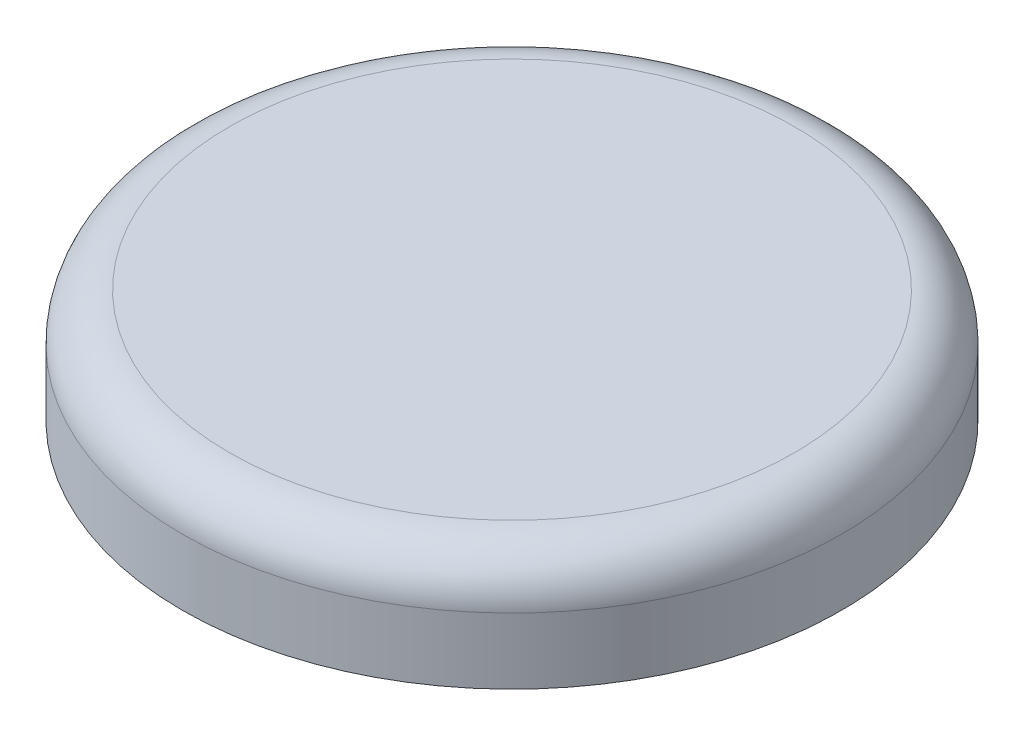
ISO-10303-21;
HEADER;
FILE_DESCRIPTION(('STEP AP214'),'2;1');
FILE_NAME('part.step','',(''),(''),'','','');
FILE_SCHEMA(('AUTOMOTIVE_DESIGN { 1 0 10303 214 1 1 1 1 }'));
ENDSEC;
DATA;
#1=APPLICATION_CONTEXT('core data for automotive mechanical design processes');
#2=APPLICATION_PROTOCOL_DEFINITION('international standard','automotive_design',2000,#1);
#3=PRODUCT_CONTEXT('',#1,'mechanical');
#4=PRODUCT('Part','Part','',(#3));
#5=PRODUCT_RELATED_PRODUCT_CATEGORY('part','',(#4));
#6=PRODUCT_DEFINITION_FORMATION('','',#4);
#7=PRODUCT_DEFINITION_CONTEXT('part definition',#1,'design');
#8=PRODUCT_DEFINITION('design','',#6,#7);
#9=PRODUCT_DEFINITION_SHAPE('','',#8);
#10=(LENGTH_UNIT() NAMED_UNIT(*) SI_UNIT(.MILLI.,.METRE.));
#11=(NAMED_UNIT(*) PLANE_ANGLE_UNIT() SI_UNIT($,.RADIAN.));
#12=(NAMED_UNIT(*) SI_UNIT($,.STERADIAN.) SOLID_ANGLE_UNIT());
#13=UNCERTAINTY_MEASURE_WITH_UNIT(LENGTH_MEASURE(1.E-05),#10,'distance_accuracy_value','');
#14=(GEOMETRIC_REPRESENTATION_CONTEXT(3) GLOBAL_UNCERTAINTY_ASSIGNED_CONTEXT((#13)) GLOBAL_UNIT_ASSIGNED_CONTEXT((#10,
#11,#12)) REPRESENTATION_CONTEXT('',''));
#15=CARTESIAN_POINT('',(0.,0.,0.));
#16=DIRECTION('',(0.,0.,1.));
#17=DIRECTION('',(1.,0.,0.));
#18=AXIS2_PLACEMENT_3D('',#15,#16,#17);
#19=CARTESIAN_POINT('',(0.,12.,0.));
#20=DIRECTION('',(0.,-1.,0.));
#21=DIRECTION('',(0.,0.,-1.));
#22=AXIS2_PLACEMENT_3D('',#19,#20,#21);
#23=CYLINDRICAL_SURFACE('',#22,35.);
#24=CARTESIAN_POINT('',(0.,7.,0.));
#25=DIRECTION('',(0.,1.,0.));
#26=DIRECTION('',(0.,0.,1.));
#27=AXIS2_PLACEMENT_3D('',#24,#25,#26);
#28=CIRCLE('',#27,35.);
#29=CARTESIAN_POINT('',(0.,7.,35.));
#30=VERTEX_POINT('',#29);
#31=EDGE_CURVE('E379',#30,#30,#28,.F.);
#32=ORIENTED_EDGE('',*,*,#31,.T.);
#33=EDGE_LOOP('',(#32));
#34=FACE_BOUND('',#33,.T.);
#35=CARTESIAN_POINT('',(0.,0.,0.));
#36=DIRECTION('',(0.,1.,0.));
#37=DIRECTION('',(0.,0.,1.));
#38=AXIS2_PLACEMENT_3D('',#35,#36,#37);
#39=CIRCLE('',#38,35.);
#40=CARTESIAN_POINT('',(0.,0.,35.));
#41=VERTEX_POINT('',#40);
#42=EDGE_CURVE('E230',#41,#41,#39,.T.);
#43=ORIENTED_EDGE('',*,*,#42,.T.);
#44=EDGE_LOOP('',(#43));
#45=FACE_BOUND('',#44,.T.);
#46=ADVANCED_FACE('F38',(#34,#45),#23,.T.);
#47=CARTESIAN_POINT('',(0.,12.,0.));
#48=DIRECTION('',(0.,1.,0.));
#49=DIRECTION('',(0.,0.,1.));
#50=AXIS2_PLACEMENT_3D('',#47,#48,#49);
#51=PLANE('',#50);
#52=CARTESIAN_POINT('',(0.,12.,0.));
#53=DIRECTION('',(0.,1.,0.));
#54=DIRECTION('',(0.,0.,1.));
#55=AXIS2_PLACEMENT_3D('',#52,#53,#54);
#56=CIRCLE('',#55,30.);
#57=CARTESIAN_POINT('',(0.,12.,30.));
#58=VERTEX_POINT('',#57);
#59=EDGE_CURVE('E375',#58,#58,#56,.T.);
#60=ORIENTED_EDGE('',*,*,#59,.T.);
#61=EDGE_LOOP('',(#60));
#62=FACE_BOUND('',#61,.T.);
#63=ADVANCED_FACE('F403',(#62),#51,.T.);
#64=CARTESIAN_POINT('',(0.,0.,0.));
#65=DIRECTION('',(0.,1.,0.));
#66=DIRECTION('',(0.,0.,1.));
#67=AXIS2_PLACEMENT_3D('',#64,#65,#66);
#68=PLANE('',#67);
#69=CARTESIAN_POINT('',(0.,0.,0.));
#70=DIRECTION('',(0.,-1.,0.));
#71=DIRECTION('',(0.,0.,-1.));
#72=AXIS2_PLACEMENT_3D('',#69,#70,#71);
#73=CIRCLE('',#72,23.6);
#74=CARTESIAN_POINT('',(0.,0.,-23.6));
#75=VERTEX_POINT('',#74);
#76=EDGE_CURVE('E546',#75,#75,#73,.T.);
#77=ORIENTED_EDGE('',*,*,#76,.F.);
#78=EDGE_LOOP('',(#77));
#79=FACE_BOUND('',#78,.T.);
#80=DIRECTION('',(0.,0.,1.));
#81=VECTOR('',#80,1.);
#82=CARTESIAN_POINT('',(32.7,0.,-2.13619599600162));
#83=LINE('',#82,#81);
#84=CARTESIAN_POINT('',(32.7,0.,-2.13619599600162));
#85=VERTEX_POINT('',#84);
#86=CARTESIAN_POINT('',(32.7,0.,2.13619599600162));
#87=VERTEX_POINT('',#86);
#88=EDGE_CURVE('E212',#85,#87,#83,.T.);
#89=ORIENTED_EDGE('',*,*,#88,.F.);
#90=DIRECTION('',(0.866025403784438,0.,0.5));
#91=VECTOR('',#90,1.);
#92=CARTESIAN_POINT('',(29.,0.,-4.27239199200323));
#93=LINE('',#92,#91);
#94=CARTESIAN_POINT('',(29.,0.,-4.27239199200323));
#95=VERTEX_POINT('',#94);
#96=EDGE_CURVE('E55',#95,#85,#93,.T.);
#97=ORIENTED_EDGE('',*,*,#96,.F.);
#98=DIRECTION('',(0.866025403784438,0.,-0.5));
#99=VECTOR('',#98,1.);
#100=CARTESIAN_POINT('',(25.3,0.,-2.13619599600162));
#101=LINE('',#100,#99);
#102=CARTESIAN_POINT('',(25.3,0.,-2.13619599600162));
#103=VERTEX_POINT('',#102);
#104=EDGE_CURVE('E189',#103,#95,#101,.T.);
#105=ORIENTED_EDGE('',*,*,#104,.F.);
#106=DIRECTION('',(0.,0.,-1.));
#107=VECTOR('',#106,1.);
#108=CARTESIAN_POINT('',(25.3,0.,2.13619599600162));
#109=LINE('',#108,#107);
#110=CARTESIAN_POINT('',(25.3,0.,2.13619599600162));
#111=VERTEX_POINT('',#110);
#112=EDGE_CURVE('E193',#111,#103,#109,.T.);
#113=ORIENTED_EDGE('',*,*,#112,.F.);
#114=DIRECTION('',(-0.866025403784439,0.,-0.5));
#115=VECTOR('',#114,1.);
#116=CARTESIAN_POINT('',(29.,0.,4.27239199200323));
#117=LINE('',#116,#115);
#118=CARTESIAN_POINT('',(29.,0.,4.27239199200323));
#119=VERTEX_POINT('',#118);
#120=EDGE_CURVE('E220',#119,#111,#117,.T.);
#121=ORIENTED_EDGE('',*,*,#120,.F.);
#122=DIRECTION('',(-0.866025403784439,0.,0.5));
#123=VECTOR('',#122,1.);
#124=CARTESIAN_POINT('',(32.7,0.,2.13619599600162));
#125=LINE('',#124,#123);
#126=EDGE_CURVE('E216',#87,#119,#125,.T.);
#127=ORIENTED_EDGE('',*,*,#126,.F.);
#128=EDGE_LOOP('',(#89,#97,#105,#113,#121,#127));
#129=FACE_BOUND('',#128,.T.);
#130=DIRECTION('',(0.866025403784439,0.,-0.499999999999999));
#131=VECTOR('',#130,1.);
#132=CARTESIAN_POINT('',(-18.199999999999,0.,-27.2509327057519));
#133=LINE('',#132,#131);
#134=CARTESIAN_POINT('',(-18.199999999999,0.,-27.2509327057519));
#135=VERTEX_POINT('',#134);
#136=CARTESIAN_POINT('',(-14.499999999999,0.,-29.3871287017535));
#137=VERTEX_POINT('',#136);
#138=EDGE_CURVE('E270',#135,#137,#133,.T.);
#139=ORIENTED_EDGE('',*,*,#138,.F.);
#140=DIRECTION('',(0.,0.,-1.));
#141=VECTOR('',#140,1.);
#142=CARTESIAN_POINT('',(-18.199999999999,0.,-22.9785407137486));
#143=LINE('',#142,#141);
#144=CARTESIAN_POINT('',(-18.199999999999,0.,-22.9785407137486));
#145=VERTEX_POINT('',#144);
#146=EDGE_CURVE('E63',#145,#135,#143,.T.);
#147=ORIENTED_EDGE('',*,*,#146,.F.);
#148=DIRECTION('',(-0.866025403784438,0.,-0.500000000000001));
#149=VECTOR('',#148,1.);
#150=CARTESIAN_POINT('',(-14.499999999999,0.,-20.842344717747));
#151=LINE('',#150,#149);
#152=CARTESIAN_POINT('',(-14.499999999999,0.,-20.842344717747));
#153=VERTEX_POINT('',#152);
#154=EDGE_CURVE('E247',#153,#145,#151,.T.);
#155=ORIENTED_EDGE('',*,*,#154,.F.);
#156=DIRECTION('',(-0.866025403784439,0.,0.5));
#157=VECTOR('',#156,1.);
#158=CARTESIAN_POINT('',(-10.799999999999,0.,-22.9785407137486));
#159=LINE('',#158,#157);
#160=CARTESIAN_POINT('',(-10.799999999999,0.,-22.9785407137486));
#161=VERTEX_POINT('',#160);
#162=EDGE_CURVE('E283',#161,#153,#159,.T.);
#163=ORIENTED_EDGE('',*,*,#162,.F.);
#164=DIRECTION('',(0.,0.,1.));
#165=VECTOR('',#164,1.);
#166=CARTESIAN_POINT('',(-10.799999999999,0.,-27.2509327057519));
#167=LINE('',#166,#165);
#168=CARTESIAN_POINT('',(-10.799999999999,0.,-27.2509327057519));
#169=VERTEX_POINT('',#168);
#170=EDGE_CURVE('E279',#169,#161,#167,.T.);
#171=ORIENTED_EDGE('',*,*,#170,.F.);
#172=DIRECTION('',(0.866025403784438,0.,0.500000000000001));
#173=VECTOR('',#172,1.);
#174=CARTESIAN_POINT('',(-14.499999999999,0.,-29.3871287017535));
#175=LINE('',#174,#173);
#176=EDGE_CURVE('E275',#137,#169,#175,.T.);
#177=ORIENTED_EDGE('',*,*,#176,.F.);
#178=EDGE_LOOP('',(#139,#147,#155,#163,#171,#177));
#179=FACE_BOUND('',#178,.T.);
#180=DIRECTION('',(-0.866025403784438,0.,-0.500000000000001));
#181=VECTOR('',#180,1.);
#182=CARTESIAN_POINT('',(-14.5000000000008,0.,29.3871287017503));
#183=LINE('',#182,#181);
#184=CARTESIAN_POINT('',(-14.5000000000008,0.,29.3871287017503));
#185=VERTEX_POINT('',#184);
#186=CARTESIAN_POINT('',(-18.2000000000008,0.,27.2509327057487));
#187=VERTEX_POINT('',#186);
#188=EDGE_CURVE('E335',#185,#187,#183,.T.);
#189=ORIENTED_EDGE('',*,*,#188,.F.);
#190=DIRECTION('',(-0.866025403784439,0.,0.5));
#191=VECTOR('',#190,1.);
#192=CARTESIAN_POINT('',(-10.8000000000008,0.,27.2509327057487));
#193=LINE('',#192,#191);
#194=CARTESIAN_POINT('',(-10.8000000000008,0.,27.2509327057487));
#195=VERTEX_POINT('',#194);
#196=EDGE_CURVE('E332',#195,#185,#193,.T.);
#197=ORIENTED_EDGE('',*,*,#196,.F.);
#198=DIRECTION('',(0.,0.,1.));
#199=VECTOR('',#198,1.);
#200=CARTESIAN_POINT('',(-10.8000000000008,0.,22.9785407137455));
#201=LINE('',#200,#199);
#202=CARTESIAN_POINT('',(-10.8000000000008,0.,22.9785407137455));
#203=VERTEX_POINT('',#202);
#204=EDGE_CURVE('E311',#203,#195,#201,.T.);
#205=ORIENTED_EDGE('',*,*,#204,.F.);
#206=DIRECTION('',(0.866025403784438,0.,0.500000000000001));
#207=VECTOR('',#206,1.);
#208=CARTESIAN_POINT('',(-14.5000000000008,0.,20.8423447177438));
#209=LINE('',#208,#207);
#210=CARTESIAN_POINT('',(-14.5000000000008,0.,20.8423447177438));
#211=VERTEX_POINT('',#210);
#212=EDGE_CURVE('E348',#211,#203,#209,.T.);
#213=ORIENTED_EDGE('',*,*,#212,.F.);
#214=DIRECTION('',(0.866025403784439,0.,-0.499999999999999));
#215=VECTOR('',#214,1.);
#216=CARTESIAN_POINT('',(-18.2000000000008,0.,22.9785407137455));
#217=LINE('',#216,#215);
#218=CARTESIAN_POINT('',(-18.2000000000008,0.,22.9785407137455));
#219=VERTEX_POINT('',#218);
#220=EDGE_CURVE('E344',#219,#211,#217,.T.);
#221=ORIENTED_EDGE('',*,*,#220,.F.);
#222=DIRECTION('',(0.,0.,-1.));
#223=VECTOR('',#222,1.);
#224=CARTESIAN_POINT('',(-18.2000000000008,0.,27.2509327057487));
#225=LINE('',#224,#223);
#226=EDGE_CURVE('E340',#187,#219,#225,.T.);
#227=ORIENTED_EDGE('',*,*,#226,.F.);
#228=EDGE_LOOP('',(#189,#197,#205,#213,#221,#227));
#229=FACE_BOUND('',#228,.T.);
#230=ORIENTED_EDGE('',*,*,#42,.F.);
#231=EDGE_LOOP('',(#230));
#232=FACE_BOUND('',#231,.T.);
#233=ADVANCED_FACE('F409',(#79,#129,#179,#229,#232),#68,.F.);
#234=CARTESIAN_POINT('',(-10.8000000000008,4.,27.2509327057487));
#235=DIRECTION('',(0.5,0.,0.866025403784439));
#236=DIRECTION('',(0.866025403784439,0.,-0.5));
#237=AXIS2_PLACEMENT_3D('',#234,#235,#236);
#238=PLANE('',#237);
#239=ORIENTED_EDGE('',*,*,#196,.T.);
#240=DIRECTION('',(0.,-1.,0.));
#241=VECTOR('',#240,1.);
#242=CARTESIAN_POINT('',(-14.5000000000008,4.,29.3871287017503));
#243=LINE('',#242,#241);
#244=CARTESIAN_POINT('',(-14.5000000000008,4.,29.3871287017503));
#245=VERTEX_POINT('',#244);
#246=EDGE_CURVE('E331',#245,#185,#243,.T.);
#247=ORIENTED_EDGE('',*,*,#246,.F.);
#248=DIRECTION('',(-0.866025403784439,0.,0.5));
#249=VECTOR('',#248,1.);
#250=CARTESIAN_POINT('',(-10.8000000000008,4.,27.2509327057487));
#251=LINE('',#250,#249);
#252=CARTESIAN_POINT('',(-10.8000000000008,4.,27.2509327057487));
#253=VERTEX_POINT('',#252);
#254=EDGE_CURVE('E306',#253,#245,#251,.T.);
#255=ORIENTED_EDGE('',*,*,#254,.F.);
#256=DIRECTION('',(0.,-1.,0.));
#257=VECTOR('',#256,1.);
#258=CARTESIAN_POINT('',(-10.8000000000008,4.,27.2509327057487));
#259=LINE('',#258,#257);
#260=EDGE_CURVE('E271',#253,#195,#259,.T.);
#261=ORIENTED_EDGE('',*,*,#260,.T.);
#262=EDGE_LOOP('',(#239,#247,#255,#261));
#263=FACE_BOUND('',#262,.T.);
#264=ADVANCED_FACE('F502',(#263),#238,.F.);
#265=CARTESIAN_POINT('',(-10.8000000000008,4.,22.9785407137455));
#266=DIRECTION('',(1.,0.,0.));
#267=DIRECTION('',(0.,0.,-1.));
#268=AXIS2_PLACEMENT_3D('',#265,#266,#267);
#269=PLANE('',#268);
#270=ORIENTED_EDGE('',*,*,#204,.T.);
#271=ORIENTED_EDGE('',*,*,#260,.F.);
#272=DIRECTION('',(0.,0.,1.));
#273=VECTOR('',#272,1.);
#274=CARTESIAN_POINT('',(-10.8000000000008,4.,22.9785407137455));
#275=LINE('',#274,#273);
#276=CARTESIAN_POINT('',(-10.8000000000008,4.,22.9785407137455));
#277=VERTEX_POINT('',#276);
#278=EDGE_CURVE('E327',#277,#253,#275,.T.);
#279=ORIENTED_EDGE('',*,*,#278,.F.);
#280=DIRECTION('',(0.,-1.,0.));
#281=VECTOR('',#280,1.);
#282=CARTESIAN_POINT('',(-10.8000000000008,4.,22.9785407137455));
#283=LINE('',#282,#281);
#284=EDGE_CURVE('E357',#277,#203,#283,.T.);
#285=ORIENTED_EDGE('',*,*,#284,.T.);
#286=EDGE_LOOP('',(#270,#271,#279,#285));
#287=FACE_BOUND('',#286,.T.);
#288=ADVANCED_FACE('F498',(#287),#269,.F.);
#289=CARTESIAN_POINT('',(-14.5000000000008,4.,20.8423447177438));
#290=DIRECTION('',(0.500000000000001,0.,-0.866025403784438));
#291=DIRECTION('',(-0.866025403784438,0.,-0.500000000000001));
#292=AXIS2_PLACEMENT_3D('',#289,#290,#291);
#293=PLANE('',#292);
#294=ORIENTED_EDGE('',*,*,#212,.T.);
#295=ORIENTED_EDGE('',*,*,#284,.F.);
#296=DIRECTION('',(0.866025403784438,0.,0.500000000000001));
#297=VECTOR('',#296,1.);
#298=CARTESIAN_POINT('',(-14.5000000000008,4.,20.8423447177438));
#299=LINE('',#298,#297);
#300=CARTESIAN_POINT('',(-14.5000000000008,4.,20.8423447177438));
#301=VERTEX_POINT('',#300);
#302=EDGE_CURVE('E323',#301,#277,#299,.T.);
#303=ORIENTED_EDGE('',*,*,#302,.F.);
#304=DIRECTION('',(0.,-1.,0.));
#305=VECTOR('',#304,1.);
#306=CARTESIAN_POINT('',(-14.5000000000008,4.,20.8423447177438));
#307=LINE('',#306,#305);
#308=EDGE_CURVE('E360',#301,#211,#307,.T.);
#309=ORIENTED_EDGE('',*,*,#308,.T.);
#310=EDGE_LOOP('',(#294,#295,#303,#309));
#311=FACE_BOUND('',#310,.T.);
#312=ADVANCED_FACE('F501',(#311),#293,.F.);
#313=CARTESIAN_POINT('',(-18.2000000000008,4.,22.9785407137455));
#314=DIRECTION('',(-0.499999999999999,0.,-0.866025403784439));
#315=DIRECTION('',(-0.866025403784439,0.,0.499999999999999));
#316=AXIS2_PLACEMENT_3D('',#313,#314,#315);
#317=PLANE('',#316);
#318=ORIENTED_EDGE('',*,*,#220,.T.);
#319=ORIENTED_EDGE('',*,*,#308,.F.);
#320=DIRECTION('',(0.866025403784439,0.,-0.499999999999999));
#321=VECTOR('',#320,1.);
#322=CARTESIAN_POINT('',(-18.2000000000008,4.,22.9785407137455));
#323=LINE('',#322,#321);
#324=CARTESIAN_POINT('',(-18.2000000000008,4.,22.9785407137455));
#325=VERTEX_POINT('',#324);
#326=EDGE_CURVE('E319',#325,#301,#323,.T.);
#327=ORIENTED_EDGE('',*,*,#326,.F.);
#328=DIRECTION('',(0.,-1.,0.));
#329=VECTOR('',#328,1.);
#330=CARTESIAN_POINT('',(-18.2000000000008,4.,22.9785407137455));
#331=LINE('',#330,#329);
#332=EDGE_CURVE('E363',#325,#219,#331,.T.);
#333=ORIENTED_EDGE('',*,*,#332,.T.);
#334=EDGE_LOOP('',(#318,#319,#327,#333));
#335=FACE_BOUND('',#334,.T.);
#336=ADVANCED_FACE('F506',(#335),#317,.F.);
#337=CARTESIAN_POINT('',(-18.2000000000008,4.,27.2509327057487));
#338=DIRECTION('',(-1.,0.,0.));
#339=DIRECTION('',(0.,0.,1.));
#340=AXIS2_PLACEMENT_3D('',#337,#338,#339);
#341=PLANE('',#340);
#342=ORIENTED_EDGE('',*,*,#226,.T.);
#343=ORIENTED_EDGE('',*,*,#332,.F.);
#344=DIRECTION('',(0.,0.,-1.));
#345=VECTOR('',#344,1.);
#346=CARTESIAN_POINT('',(-18.2000000000008,4.,27.2509327057487));
#347=LINE('',#346,#345);
#348=CARTESIAN_POINT('',(-18.2000000000008,4.,27.2509327057487));
#349=VERTEX_POINT('',#348);
#350=EDGE_CURVE('E315',#349,#325,#347,.T.);
#351=ORIENTED_EDGE('',*,*,#350,.F.);
#352=DIRECTION('',(0.,-1.,0.));
#353=VECTOR('',#352,1.);
#354=CARTESIAN_POINT('',(-18.2000000000008,4.,27.2509327057487));
#355=LINE('',#354,#353);
#356=EDGE_CURVE('E366',#349,#187,#355,.T.);
#357=ORIENTED_EDGE('',*,*,#356,.T.);
#358=EDGE_LOOP('',(#342,#343,#351,#357));
#359=FACE_BOUND('',#358,.T.);
#360=ADVANCED_FACE('F510',(#359),#341,.F.);
#361=CARTESIAN_POINT('',(-14.5000000000008,4.,29.3871287017503));
#362=DIRECTION('',(-0.500000000000001,0.,0.866025403784438));
#363=DIRECTION('',(0.866025403784438,0.,0.500000000000001));
#364=AXIS2_PLACEMENT_3D('',#361,#362,#363);
#365=PLANE('',#364);
#366=ORIENTED_EDGE('',*,*,#188,.T.);
#367=ORIENTED_EDGE('',*,*,#356,.F.);
#368=DIRECTION('',(-0.866025403784438,0.,-0.500000000000001));
#369=VECTOR('',#368,1.);
#370=CARTESIAN_POINT('',(-14.5000000000008,4.,29.3871287017503));
#371=LINE('',#370,#369);
#372=EDGE_CURVE('E310',#245,#349,#371,.T.);
#373=ORIENTED_EDGE('',*,*,#372,.F.);
#374=ORIENTED_EDGE('',*,*,#246,.T.);
#375=EDGE_LOOP('',(#366,#367,#373,#374));
#376=FACE_BOUND('',#375,.T.);
#377=ADVANCED_FACE('F496',(#376),#365,.F.);
#378=CARTESIAN_POINT('',(0.,4.,0.));
#379=DIRECTION('',(0.,-1.,0.));
#380=DIRECTION('',(0.,0.,-1.));
#381=AXIS2_PLACEMENT_3D('',#378,#379,#380);
#382=PLANE('',#381);
#383=CARTESIAN_POINT('',(-14.4999999999998,4.,25.1147367097489));
#384=DIRECTION('',(0.,-1.,0.));
#385=DIRECTION('',(0.,0.,-1.));
#386=AXIS2_PLACEMENT_3D('',#383,#384,#385);
#387=CIRCLE('',#386,2.00000000000001);
#388=CARTESIAN_POINT('',(-14.4999999999998,4.,23.1147367097488));
#389=VERTEX_POINT('',#388);
#390=EDGE_CURVE('E196',#389,#389,#387,.T.);
#391=ORIENTED_EDGE('',*,*,#390,.F.);
#392=EDGE_LOOP('',(#391));
#393=FACE_BOUND('',#392,.T.);
#394=ORIENTED_EDGE('',*,*,#254,.T.);
#395=ORIENTED_EDGE('',*,*,#372,.T.);
#396=ORIENTED_EDGE('',*,*,#350,.T.);
#397=ORIENTED_EDGE('',*,*,#326,.T.);
#398=ORIENTED_EDGE('',*,*,#302,.T.);
#399=ORIENTED_EDGE('',*,*,#278,.T.);
#400=EDGE_LOOP('',(#394,#395,#396,#397,#398,#399));
#401=FACE_BOUND('',#400,.T.);
#402=ADVANCED_FACE('F493',(#393,#401),#382,.T.);
#403=CARTESIAN_POINT('',(-18.199999999999,4.,-22.9785407137486));
#404=DIRECTION('',(-1.,0.,0.));
#405=DIRECTION('',(0.,0.,1.));
#406=AXIS2_PLACEMENT_3D('',#403,#404,#405);
#407=PLANE('',#406);
#408=ORIENTED_EDGE('',*,*,#146,.T.);
#409=DIRECTION('',(0.,-1.,0.));
#410=VECTOR('',#409,1.);
#411=CARTESIAN_POINT('',(-18.199999999999,4.,-27.2509327057519));
#412=LINE('',#411,#410);
#413=CARTESIAN_POINT('',(-18.199999999999,4.,-27.2509327057519));
#414=VERTEX_POINT('',#413);
#415=EDGE_CURVE('E267',#414,#135,#412,.T.);
#416=ORIENTED_EDGE('',*,*,#415,.F.);
#417=DIRECTION('',(0.,0.,-1.));
#418=VECTOR('',#417,1.);
#419=CARTESIAN_POINT('',(-18.199999999999,4.,-22.9785407137486));
#420=LINE('',#419,#418);
#421=CARTESIAN_POINT('',(-18.199999999999,4.,-22.9785407137486));
#422=VERTEX_POINT('',#421);
#423=EDGE_CURVE('E242',#422,#414,#420,.T.);
#424=ORIENTED_EDGE('',*,*,#423,.F.);
#425=DIRECTION('',(0.,-1.,0.));
#426=VECTOR('',#425,1.);
#427=CARTESIAN_POINT('',(-18.199999999999,4.,-22.9785407137486));
#428=LINE('',#427,#426);
#429=EDGE_CURVE('E213',#422,#145,#428,.T.);
#430=ORIENTED_EDGE('',*,*,#429,.T.);
#431=EDGE_LOOP('',(#408,#416,#424,#430));
#432=FACE_BOUND('',#431,.T.);
#433=ADVANCED_FACE('F475',(#432),#407,.F.);
#434=CARTESIAN_POINT('',(-14.499999999999,4.,-20.842344717747));
#435=DIRECTION('',(-0.500000000000001,0.,0.866025403784438));
#436=DIRECTION('',(0.866025403784438,0.,0.500000000000001));
#437=AXIS2_PLACEMENT_3D('',#434,#435,#436);
#438=PLANE('',#437);
#439=ORIENTED_EDGE('',*,*,#154,.T.);
#440=ORIENTED_EDGE('',*,*,#429,.F.);
#441=DIRECTION('',(-0.866025403784438,0.,-0.500000000000001));
#442=VECTOR('',#441,1.);
#443=CARTESIAN_POINT('',(-14.499999999999,4.,-20.842344717747));
#444=LINE('',#443,#442);
#445=CARTESIAN_POINT('',(-14.499999999999,4.,-20.842344717747));
#446=VERTEX_POINT('',#445);
#447=EDGE_CURVE('E263',#446,#422,#444,.T.);
#448=ORIENTED_EDGE('',*,*,#447,.F.);
#449=DIRECTION('',(0.,-1.,0.));
#450=VECTOR('',#449,1.);
#451=CARTESIAN_POINT('',(-14.499999999999,4.,-20.842344717747));
#452=LINE('',#451,#450);
#453=EDGE_CURVE('E292',#446,#153,#452,.T.);
#454=ORIENTED_EDGE('',*,*,#453,.T.);
#455=EDGE_LOOP('',(#439,#440,#448,#454));
#456=FACE_BOUND('',#455,.T.);
#457=ADVANCED_FACE('F471',(#456),#438,.F.);
#458=CARTESIAN_POINT('',(-10.799999999999,4.,-22.9785407137486));
#459=DIRECTION('',(0.5,0.,0.866025403784439));
#460=DIRECTION('',(0.866025403784439,0.,-0.5));
#461=AXIS2_PLACEMENT_3D('',#458,#459,#460);
#462=PLANE('',#461);
#463=ORIENTED_EDGE('',*,*,#162,.T.);
#464=ORIENTED_EDGE('',*,*,#453,.F.);
#465=DIRECTION('',(-0.866025403784439,0.,0.5));
#466=VECTOR('',#465,1.);
#467=CARTESIAN_POINT('',(-10.799999999999,4.,-22.9785407137486));
#468=LINE('',#467,#466);
#469=CARTESIAN_POINT('',(-10.799999999999,4.,-22.9785407137486));
#470=VERTEX_POINT('',#469);
#471=EDGE_CURVE('E259',#470,#446,#468,.T.);
#472=ORIENTED_EDGE('',*,*,#471,.F.);
#473=DIRECTION('',(0.,-1.,0.));
#474=VECTOR('',#473,1.);
#475=CARTESIAN_POINT('',(-10.799999999999,4.,-22.9785407137486));
#476=LINE('',#475,#474);
#477=EDGE_CURVE('E295',#470,#161,#476,.T.);
#478=ORIENTED_EDGE('',*,*,#477,.T.);
#479=EDGE_LOOP('',(#463,#464,#472,#478));
#480=FACE_BOUND('',#479,.T.);
#481=ADVANCED_FACE('F474',(#480),#462,.F.);
#482=CARTESIAN_POINT('',(-10.799999999999,4.,-27.2509327057519));
#483=DIRECTION('',(1.,0.,0.));
#484=DIRECTION('',(0.,0.,-1.));
#485=AXIS2_PLACEMENT_3D('',#482,#483,#484);
#486=PLANE('',#485);
#487=ORIENTED_EDGE('',*,*,#170,.T.);
#488=ORIENTED_EDGE('',*,*,#477,.F.);
#489=DIRECTION('',(0.,0.,1.));
#490=VECTOR('',#489,1.);
#491=CARTESIAN_POINT('',(-10.799999999999,4.,-27.2509327057519));
#492=LINE('',#491,#490);
#493=CARTESIAN_POINT('',(-10.799999999999,4.,-27.2509327057519));
#494=VERTEX_POINT('',#493);
#495=EDGE_CURVE('E255',#494,#470,#492,.T.);
#496=ORIENTED_EDGE('',*,*,#495,.F.);
#497=DIRECTION('',(0.,-1.,0.));
#498=VECTOR('',#497,1.);
#499=CARTESIAN_POINT('',(-10.799999999999,4.,-27.2509327057519));
#500=LINE('',#499,#498);
#501=EDGE_CURVE('E298',#494,#169,#500,.T.);
#502=ORIENTED_EDGE('',*,*,#501,.T.);
#503=EDGE_LOOP('',(#487,#488,#496,#502));
#504=FACE_BOUND('',#503,.T.);
#505=ADVANCED_FACE('F479',(#504),#486,.F.);
#506=CARTESIAN_POINT('',(-14.499999999999,4.,-29.3871287017535));
#507=DIRECTION('',(0.500000000000001,0.,-0.866025403784438));
#508=DIRECTION('',(-0.866025403784438,0.,-0.500000000000001));
#509=AXIS2_PLACEMENT_3D('',#506,#507,#508);
#510=PLANE('',#509);
#511=ORIENTED_EDGE('',*,*,#176,.T.);
#512=ORIENTED_EDGE('',*,*,#501,.F.);
#513=DIRECTION('',(0.866025403784438,0.,0.500000000000001));
#514=VECTOR('',#513,1.);
#515=CARTESIAN_POINT('',(-14.499999999999,4.,-29.3871287017535));
#516=LINE('',#515,#514);
#517=CARTESIAN_POINT('',(-14.499999999999,4.,-29.3871287017535));
#518=VERTEX_POINT('',#517);
#519=EDGE_CURVE('E251',#518,#494,#516,.T.);
#520=ORIENTED_EDGE('',*,*,#519,.F.);
#521=DIRECTION('',(0.,-1.,0.));
#522=VECTOR('',#521,1.);
#523=CARTESIAN_POINT('',(-14.499999999999,4.,-29.3871287017535));
#524=LINE('',#523,#522);
#525=EDGE_CURVE('E301',#518,#137,#524,.T.);
#526=ORIENTED_EDGE('',*,*,#525,.T.);
#527=EDGE_LOOP('',(#511,#512,#520,#526));
#528=FACE_BOUND('',#527,.T.);
#529=ADVANCED_FACE('F483',(#528),#510,.F.);
#530=CARTESIAN_POINT('',(-18.199999999999,4.,-27.2509327057519));
#531=DIRECTION('',(-0.499999999999999,0.,-0.866025403784439));
#532=DIRECTION('',(-0.866025403784439,0.,0.499999999999999));
#533=AXIS2_PLACEMENT_3D('',#530,#531,#532);
#534=PLANE('',#533);
#535=ORIENTED_EDGE('',*,*,#138,.T.);
#536=ORIENTED_EDGE('',*,*,#525,.F.);
#537=DIRECTION('',(0.866025403784439,0.,-0.499999999999999));
#538=VECTOR('',#537,1.);
#539=CARTESIAN_POINT('',(-18.199999999999,4.,-27.2509327057519));
#540=LINE('',#539,#538);
#541=EDGE_CURVE('E246',#414,#518,#540,.T.);
#542=ORIENTED_EDGE('',*,*,#541,.F.);
#543=ORIENTED_EDGE('',*,*,#415,.T.);
#544=EDGE_LOOP('',(#535,#536,#542,#543));
#545=FACE_BOUND('',#544,.T.);
#546=ADVANCED_FACE('F469',(#545),#534,.F.);
#547=CARTESIAN_POINT('',(0.,4.,0.));
#548=DIRECTION('',(0.,-1.,0.));
#549=DIRECTION('',(0.,0.,-1.));
#550=AXIS2_PLACEMENT_3D('',#547,#548,#549);
#551=PLANE('',#550);
#552=CARTESIAN_POINT('',(-14.5000000000001,4.,-25.1147367097487));
#553=DIRECTION('',(0.,-1.,0.));
#554=DIRECTION('',(0.,0.,-1.));
#555=AXIS2_PLACEMENT_3D('',#552,#553,#554);
#556=CIRCLE('',#555,2.);
#557=CARTESIAN_POINT('',(-14.5000000000001,4.,-27.1147367097487));
#558=VERTEX_POINT('',#557);
#559=EDGE_CURVE('E585',#558,#558,#556,.T.);
#560=ORIENTED_EDGE('',*,*,#559,.F.);
#561=EDGE_LOOP('',(#560));
#562=FACE_BOUND('',#561,.T.);
#563=ORIENTED_EDGE('',*,*,#423,.T.);
#564=ORIENTED_EDGE('',*,*,#541,.T.);
#565=ORIENTED_EDGE('',*,*,#519,.T.);
#566=ORIENTED_EDGE('',*,*,#495,.T.);
#567=ORIENTED_EDGE('',*,*,#471,.T.);
#568=ORIENTED_EDGE('',*,*,#447,.T.);
#569=EDGE_LOOP('',(#563,#564,#565,#566,#567,#568));
#570=FACE_BOUND('',#569,.T.);
#571=ADVANCED_FACE('F466',(#562,#570),#551,.T.);
#572=CARTESIAN_POINT('',(29.,4.,-4.27239199200323));
#573=DIRECTION('',(0.5,0.,-0.866025403784438));
#574=DIRECTION('',(-0.866025403784438,0.,-0.5));
#575=AXIS2_PLACEMENT_3D('',#572,#573,#574);
#576=PLANE('',#575);
#577=ORIENTED_EDGE('',*,*,#96,.T.);
#578=DIRECTION('',(0.,-1.,0.));
#579=VECTOR('',#578,1.);
#580=CARTESIAN_POINT('',(32.7,4.,-2.13619599600162));
#581=LINE('',#580,#579);
#582=CARTESIAN_POINT('',(32.7,4.,-2.13619599600162));
#583=VERTEX_POINT('',#582);
#584=EDGE_CURVE('E163',#583,#85,#581,.T.);
#585=ORIENTED_EDGE('',*,*,#584,.F.);
#586=DIRECTION('',(0.866025403784438,0.,0.5));
#587=VECTOR('',#586,1.);
#588=CARTESIAN_POINT('',(29.,4.,-4.27239199200323));
#589=LINE('',#588,#587);
#590=CARTESIAN_POINT('',(29.,4.,-4.27239199200323));
#591=VERTEX_POINT('',#590);
#592=EDGE_CURVE('E167',#591,#583,#589,.T.);
#593=ORIENTED_EDGE('',*,*,#592,.F.);
#594=DIRECTION('',(0.,-1.,0.));
#595=VECTOR('',#594,1.);
#596=CARTESIAN_POINT('',(29.,4.,-4.27239199200323));
#597=LINE('',#596,#595);
#598=EDGE_CURVE('E227',#591,#95,#597,.T.);
#599=ORIENTED_EDGE('',*,*,#598,.T.);
#600=EDGE_LOOP('',(#577,#585,#593,#599));
#601=FACE_BOUND('',#600,.T.);
#602=ADVANCED_FACE('F165',(#601),#576,.F.);
#603=CARTESIAN_POINT('',(25.3,4.,-2.13619599600162));
#604=DIRECTION('',(-0.5,0.,-0.866025403784439));
#605=DIRECTION('',(-0.866025403784439,0.,0.5));
#606=AXIS2_PLACEMENT_3D('',#603,#604,#605);
#607=PLANE('',#606);
#608=ORIENTED_EDGE('',*,*,#104,.T.);
#609=ORIENTED_EDGE('',*,*,#598,.F.);
#610=DIRECTION('',(0.866025403784438,0.,-0.5));
#611=VECTOR('',#610,1.);
#612=CARTESIAN_POINT('',(25.3,4.,-2.13619599600162));
#613=LINE('',#612,#611);
#614=CARTESIAN_POINT('',(25.3,4.,-2.13619599600162));
#615=VERTEX_POINT('',#614);
#616=EDGE_CURVE('E174',#615,#591,#613,.T.);
#617=ORIENTED_EDGE('',*,*,#616,.F.);
#618=DIRECTION('',(0.,-1.,0.));
#619=VECTOR('',#618,1.);
#620=CARTESIAN_POINT('',(25.3,4.,-2.13619599600162));
#621=LINE('',#620,#619);
#622=EDGE_CURVE('E231',#615,#103,#621,.T.);
#623=ORIENTED_EDGE('',*,*,#622,.T.);
#624=EDGE_LOOP('',(#608,#609,#617,#623));
#625=FACE_BOUND('',#624,.T.);
#626=ADVANCED_FACE('F446',(#625),#607,.F.);
#627=CARTESIAN_POINT('',(25.3,4.,2.13619599600162));
#628=DIRECTION('',(-1.,0.,0.));
#629=DIRECTION('',(0.,0.,1.));
#630=AXIS2_PLACEMENT_3D('',#627,#628,#629);
#631=PLANE('',#630);
#632=ORIENTED_EDGE('',*,*,#112,.T.);
#633=ORIENTED_EDGE('',*,*,#622,.F.);
#634=DIRECTION('',(0.,0.,-1.));
#635=VECTOR('',#634,1.);
#636=CARTESIAN_POINT('',(25.3,4.,2.13619599600162));
#637=LINE('',#636,#635);
#638=CARTESIAN_POINT('',(25.3,4.,2.13619599600162));
#639=VERTEX_POINT('',#638);
#640=EDGE_CURVE('E205',#639,#615,#637,.T.);
#641=ORIENTED_EDGE('',*,*,#640,.F.);
#642=DIRECTION('',(0.,-1.,0.));
#643=VECTOR('',#642,1.);
#644=CARTESIAN_POINT('',(25.3,4.,2.13619599600162));
#645=LINE('',#644,#643);
#646=EDGE_CURVE('E234',#639,#111,#645,.T.);
#647=ORIENTED_EDGE('',*,*,#646,.T.);
#648=EDGE_LOOP('',(#632,#633,#641,#647));
#649=FACE_BOUND('',#648,.T.);
#650=ADVANCED_FACE('F449',(#649),#631,.F.);
#651=CARTESIAN_POINT('',(29.,4.,4.27239199200323));
#652=DIRECTION('',(-0.5,0.,0.866025403784439));
#653=DIRECTION('',(0.866025403784439,0.,0.5));
#654=AXIS2_PLACEMENT_3D('',#651,#652,#653);
#655=PLANE('',#654);
#656=ORIENTED_EDGE('',*,*,#120,.T.);
#657=ORIENTED_EDGE('',*,*,#646,.F.);
#658=DIRECTION('',(-0.866025403784439,0.,-0.5));
#659=VECTOR('',#658,1.);
#660=CARTESIAN_POINT('',(29.,4.,4.27239199200323));
#661=LINE('',#660,#659);
#662=CARTESIAN_POINT('',(29.,4.,4.27239199200323));
#663=VERTEX_POINT('',#662);
#664=EDGE_CURVE('E201',#663,#639,#661,.T.);
#665=ORIENTED_EDGE('',*,*,#664,.F.);
#666=DIRECTION('',(0.,-1.,0.));
#667=VECTOR('',#666,1.);
#668=CARTESIAN_POINT('',(29.,4.,4.27239199200323));
#669=LINE('',#668,#667);
#670=EDGE_CURVE('E237',#663,#119,#669,.T.);
#671=ORIENTED_EDGE('',*,*,#670,.T.);
#672=EDGE_LOOP('',(#656,#657,#665,#671));
#673=FACE_BOUND('',#672,.T.);
#674=ADVANCED_FACE('F453',(#673),#655,.F.);
#675=CARTESIAN_POINT('',(32.7,4.,2.13619599600162));
#676=DIRECTION('',(0.5,0.,0.866025403784439));
#677=DIRECTION('',(0.866025403784439,0.,-0.5));
#678=AXIS2_PLACEMENT_3D('',#675,#676,#677);
#679=PLANE('',#678);
#680=ORIENTED_EDGE('',*,*,#126,.T.);
#681=ORIENTED_EDGE('',*,*,#670,.F.);
#682=DIRECTION('',(-0.866025403784439,0.,0.5));
#683=VECTOR('',#682,1.);
#684=CARTESIAN_POINT('',(32.7,4.,2.13619599600162));
#685=LINE('',#684,#683);
#686=CARTESIAN_POINT('',(32.7,4.,2.13619599600162));
#687=VERTEX_POINT('',#686);
#688=EDGE_CURVE('E183',#687,#663,#685,.T.);
#689=ORIENTED_EDGE('',*,*,#688,.F.);
#690=DIRECTION('',(0.,-1.,0.));
#691=VECTOR('',#690,1.);
#692=CARTESIAN_POINT('',(32.7,4.,2.13619599600162));
#693=LINE('',#692,#691);
#694=EDGE_CURVE('E173',#687,#87,#693,.T.);
#695=ORIENTED_EDGE('',*,*,#694,.T.);
#696=EDGE_LOOP('',(#680,#681,#689,#695));
#697=FACE_BOUND('',#696,.T.);
#698=ADVANCED_FACE('F457',(#697),#679,.F.);
#699=CARTESIAN_POINT('',(32.7,4.,-2.13619599600162));
#700=DIRECTION('',(1.,0.,0.));
#701=DIRECTION('',(0.,0.,-1.));
#702=AXIS2_PLACEMENT_3D('',#699,#700,#701);
#703=PLANE('',#702);
#704=ORIENTED_EDGE('',*,*,#88,.T.);
#705=ORIENTED_EDGE('',*,*,#694,.F.);
#706=DIRECTION('',(0.,0.,1.));
#707=VECTOR('',#706,1.);
#708=CARTESIAN_POINT('',(32.7,4.,-2.13619599600162));
#709=LINE('',#708,#707);
#710=EDGE_CURVE('E177',#583,#687,#709,.T.);
#711=ORIENTED_EDGE('',*,*,#710,.F.);
#712=ORIENTED_EDGE('',*,*,#584,.T.);
#713=EDGE_LOOP('',(#704,#705,#711,#712));
#714=FACE_BOUND('',#713,.T.);
#715=ADVANCED_FACE('F178',(#714),#703,.F.);
#716=CARTESIAN_POINT('',(0.,4.,0.));
#717=DIRECTION('',(0.,-1.,0.));
#718=DIRECTION('',(0.,0.,-1.));
#719=AXIS2_PLACEMENT_3D('',#716,#717,#718);
#720=PLANE('',#719);
#721=CARTESIAN_POINT('',(29.,4.,0.));
#722=DIRECTION('',(0.,-1.,0.));
#723=DIRECTION('',(0.,0.,-1.));
#724=AXIS2_PLACEMENT_3D('',#721,#722,#723);
#725=CIRCLE('',#724,2.);
#726=CARTESIAN_POINT('',(29.,4.,-2.));
#727=VERTEX_POINT('',#726);
#728=EDGE_CURVE('E577',#727,#727,#725,.T.);
#729=ORIENTED_EDGE('',*,*,#728,.F.);
#730=EDGE_LOOP('',(#729));
#731=FACE_BOUND('',#730,.T.);
#732=ORIENTED_EDGE('',*,*,#592,.T.);
#733=ORIENTED_EDGE('',*,*,#710,.T.);
#734=ORIENTED_EDGE('',*,*,#688,.T.);
#735=ORIENTED_EDGE('',*,*,#664,.T.);
#736=ORIENTED_EDGE('',*,*,#640,.T.);
#737=ORIENTED_EDGE('',*,*,#616,.T.);
#738=EDGE_LOOP('',(#732,#733,#734,#735,#736,#737));
#739=FACE_BOUND('',#738,.T.);
#740=ADVANCED_FACE('F185',(#731,#739),#720,.T.);
#741=CARTESIAN_POINT('',(29.,9.,0.));
#742=DIRECTION('',(0.,-1.,0.));
#743=DIRECTION('',(0.,0.,-1.));
#744=AXIS2_PLACEMENT_3D('',#741,#742,#743);
#745=CYLINDRICAL_SURFACE('',#744,2.);
#746=CARTESIAN_POINT('',(29.,9.,0.));
#747=DIRECTION('',(0.,-1.,0.));
#748=DIRECTION('',(0.,0.,-1.));
#749=AXIS2_PLACEMENT_3D('',#746,#747,#748);
#750=CIRCLE('',#749,2.);
#751=CARTESIAN_POINT('',(29.,9.,-2.));
#752=VERTEX_POINT('',#751);
#753=EDGE_CURVE('E336',#752,#752,#750,.T.);
#754=ORIENTED_EDGE('',*,*,#753,.F.);
#755=EDGE_LOOP('',(#754));
#756=FACE_BOUND('',#755,.T.);
#757=ORIENTED_EDGE('',*,*,#728,.T.);
#758=EDGE_LOOP('',(#757));
#759=FACE_BOUND('',#758,.T.);
#760=ADVANCED_FACE('F444',(#756,#759),#745,.F.);
#761=CARTESIAN_POINT('',(29.,9.,0.));
#762=DIRECTION('',(0.,-1.,0.));
#763=DIRECTION('',(0.,0.,-1.));
#764=AXIS2_PLACEMENT_3D('',#761,#762,#763);
#765=PLANE('',#764);
#766=ORIENTED_EDGE('',*,*,#753,.T.);
#767=EDGE_LOOP('',(#766));
#768=FACE_BOUND('',#767,.T.);
#769=ADVANCED_FACE('F603',(#768),#765,.T.);
#770=CARTESIAN_POINT('',(-14.5000000000001,9.,-25.1147367097487));
#771=DIRECTION('',(0.,-1.,0.));
#772=DIRECTION('',(0.,0.,-1.));
#773=AXIS2_PLACEMENT_3D('',#770,#771,#772);
#774=CYLINDRICAL_SURFACE('',#773,2.);
#775=CARTESIAN_POINT('',(-14.5000000000001,9.,-25.1147367097487));
#776=DIRECTION('',(0.,-1.,0.));
#777=DIRECTION('',(0.,0.,-1.));
#778=AXIS2_PLACEMENT_3D('',#775,#776,#777);
#779=CIRCLE('',#778,2.);
#780=CARTESIAN_POINT('',(-14.5000000000001,9.,-27.1147367097487));
#781=VERTEX_POINT('',#780);
#782=EDGE_CURVE('E581',#781,#781,#779,.T.);
#783=ORIENTED_EDGE('',*,*,#782,.F.);
#784=EDGE_LOOP('',(#783));
#785=FACE_BOUND('',#784,.T.);
#786=ORIENTED_EDGE('',*,*,#559,.T.);
#787=EDGE_LOOP('',(#786));
#788=FACE_BOUND('',#787,.T.);
#789=ADVANCED_FACE('F439',(#785,#788),#774,.F.);
#790=CARTESIAN_POINT('',(-14.5000000000001,9.,-25.1147367097487));
#791=DIRECTION('',(0.,-1.,0.));
#792=DIRECTION('',(0.,0.,-1.));
#793=AXIS2_PLACEMENT_3D('',#790,#791,#792);
#794=PLANE('',#793);
#795=ORIENTED_EDGE('',*,*,#782,.T.);
#796=EDGE_LOOP('',(#795));
#797=FACE_BOUND('',#796,.T.);
#798=ADVANCED_FACE('F434',(#797),#794,.T.);
#799=CARTESIAN_POINT('',(-14.4999999999998,9.,25.1147367097489));
#800=DIRECTION('',(0.,-1.,0.));
#801=DIRECTION('',(0.,0.,-1.));
#802=AXIS2_PLACEMENT_3D('',#799,#800,#801);
#803=CYLINDRICAL_SURFACE('',#802,2.00000000000001);
#804=CARTESIAN_POINT('',(-14.4999999999998,9.,25.1147367097489));
#805=DIRECTION('',(0.,-1.,0.));
#806=DIRECTION('',(0.,0.,-1.));
#807=AXIS2_PLACEMENT_3D('',#804,#805,#806);
#808=CIRCLE('',#807,2.00000000000001);
#809=CARTESIAN_POINT('',(-14.4999999999998,9.,23.1147367097488));
#810=VERTEX_POINT('',#809);
#811=EDGE_CURVE('E588',#810,#810,#808,.T.);
#812=ORIENTED_EDGE('',*,*,#811,.F.);
#813=EDGE_LOOP('',(#812));
#814=FACE_BOUND('',#813,.T.);
#815=ORIENTED_EDGE('',*,*,#390,.T.);
#816=EDGE_LOOP('',(#815));
#817=FACE_BOUND('',#816,.T.);
#818=ADVANCED_FACE('F425',(#814,#817),#803,.F.);
#819=CARTESIAN_POINT('',(-14.4999999999998,9.,25.1147367097489));
#820=DIRECTION('',(0.,-1.,0.));
#821=DIRECTION('',(0.,0.,-1.));
#822=AXIS2_PLACEMENT_3D('',#819,#820,#821);
#823=PLANE('',#822);
#824=ORIENTED_EDGE('',*,*,#811,.T.);
#825=EDGE_LOOP('',(#824));
#826=FACE_BOUND('',#825,.T.);
#827=ADVANCED_FACE('F417',(#826),#823,.T.);
#828=CARTESIAN_POINT('',(0.,7.,0.));
#829=DIRECTION('',(0.,1.,0.));
#830=DIRECTION('',(0.,0.,1.));
#831=AXIS2_PLACEMENT_3D('',#828,#829,#830);
#832=TOROIDAL_SURFACE('',#831,30.,5.);
#833=ORIENTED_EDGE('',*,*,#31,.F.);
#834=EDGE_LOOP('',(#833));
#835=FACE_BOUND('',#834,.T.);
#836=ORIENTED_EDGE('',*,*,#59,.F.);
#837=EDGE_LOOP('',(#836));
#838=FACE_BOUND('',#837,.T.);
#839=ADVANCED_FACE('F414',(#835,#838),#832,.T.);
#840=CARTESIAN_POINT('',(0.,2.3,0.));
#841=DIRECTION('',(0.,-1.,0.));
#842=DIRECTION('',(0.,0.,-1.));
#843=AXIS2_PLACEMENT_3D('',#840,#841,#842);
#844=PLANE('',#843);
#845=CARTESIAN_POINT('',(0.,2.3,0.));
#846=DIRECTION('',(0.,-1.,0.));
#847=DIRECTION('',(0.,0.,-1.));
#848=AXIS2_PLACEMENT_3D('',#845,#846,#847);
#849=CIRCLE('',#848,23.6);
#850=CARTESIAN_POINT('',(0.,2.3,-23.6));
#851=VERTEX_POINT('',#850);
#852=EDGE_CURVE('E568',#851,#851,#849,.T.);
#853=ORIENTED_EDGE('',*,*,#852,.T.);
#854=EDGE_LOOP('',(#853));
#855=FACE_BOUND('',#854,.T.);
#856=CARTESIAN_POINT('',(0.,2.3,0.));
#857=DIRECTION('',(0.,-1.,0.));
#858=DIRECTION('',(0.,0.,-1.));
#859=AXIS2_PLACEMENT_3D('',#856,#857,#858);
#860=CIRCLE('',#859,20.);
#861=CARTESIAN_POINT('',(0.,2.3,-20.));
#862=VERTEX_POINT('',#861);
#863=EDGE_CURVE('E42',#862,#862,#860,.F.);
#864=ORIENTED_EDGE('',*,*,#863,.T.);
#865=EDGE_LOOP('',(#864));
#866=FACE_BOUND('',#865,.T.);
#867=ADVANCED_FACE('F416',(#855,#866),#844,.T.);
#868=CARTESIAN_POINT('',(0.,2.3,0.));
#869=DIRECTION('',(0.,-1.,0.));
#870=DIRECTION('',(0.,0.,-1.));
#871=AXIS2_PLACEMENT_3D('',#868,#869,#870);
#872=CYLINDRICAL_SURFACE('',#871,23.6);
#873=ORIENTED_EDGE('',*,*,#852,.F.);
#874=EDGE_LOOP('',(#873));
#875=FACE_BOUND('',#874,.T.);
#876=ORIENTED_EDGE('',*,*,#76,.T.);
#877=EDGE_LOOP('',(#876));
#878=FACE_BOUND('',#877,.T.);
#879=ADVANCED_FACE('F399',(#875,#878),#872,.F.);
#880=CARTESIAN_POINT('',(0.,10.,0.));
#881=DIRECTION('',(0.,-1.,0.));
#882=DIRECTION('',(0.,0.,-1.));
#883=AXIS2_PLACEMENT_3D('',#880,#881,#882);
#884=PLANE('',#883);
#885=CARTESIAN_POINT('',(0.,10.,0.));
#886=DIRECTION('',(0.,-1.,0.));
#887=DIRECTION('',(0.,0.,-1.));
#888=AXIS2_PLACEMENT_3D('',#885,#886,#887);
#889=CIRCLE('',#888,15.);
#890=CARTESIAN_POINT('',(0.,10.,-15.));
#891=VERTEX_POINT('',#890);
#892=EDGE_CURVE('E48',#891,#891,#889,.T.);
#893=ORIENTED_EDGE('',*,*,#892,.T.);
#894=EDGE_LOOP('',(#893));
#895=FACE_BOUND('',#894,.T.);
#896=ADVANCED_FACE('F387',(#895),#884,.T.);
#897=CARTESIAN_POINT('',(0.,5.,0.));
#898=DIRECTION('',(0.,-1.,0.));
#899=DIRECTION('',(0.,0.,-1.));
#900=AXIS2_PLACEMENT_3D('',#897,#898,#899);
#901=TOROIDAL_SURFACE('',#900,15.,5.);
#902=CARTESIAN_POINT('',(0.,5.,0.));
#903=DIRECTION('',(0.,-1.,0.));
#904=DIRECTION('',(0.,0.,-1.));
#905=AXIS2_PLACEMENT_3D('',#902,#903,#904);
#906=CIRCLE('',#905,20.);
#907=CARTESIAN_POINT('',(0.,5.,-20.));
#908=VERTEX_POINT('',#907);
#909=EDGE_CURVE('E11',#908,#908,#906,.F.);
#910=ORIENTED_EDGE('',*,*,#909,.F.);
#911=EDGE_LOOP('',(#910));
#912=FACE_BOUND('',#911,.T.);
#913=ORIENTED_EDGE('',*,*,#892,.F.);
#914=EDGE_LOOP('',(#913));
#915=FACE_BOUND('',#914,.T.);
#916=ADVANCED_FACE('F40',(#912,#915),#901,.F.);
#917=CARTESIAN_POINT('',(0.,10.,0.));
#918=DIRECTION('',(0.,-1.,0.));
#919=DIRECTION('',(0.,0.,-1.));
#920=AXIS2_PLACEMENT_3D('',#917,#918,#919);
#921=CYLINDRICAL_SURFACE('',#920,20.);
#922=ORIENTED_EDGE('',*,*,#909,.T.);
#923=EDGE_LOOP('',(#922));
#924=FACE_BOUND('',#923,.T.);
#925=ORIENTED_EDGE('',*,*,#863,.F.);
#926=EDGE_LOOP('',(#925));
#927=FACE_BOUND('',#926,.T.);
#928=ADVANCED_FACE('F390',(#924,#927),#921,.F.);
#929=CLOSED_SHELL('',(#46,#63,#233,#264,#288,#312,#336,#360,#377,#402,#433,#457,#481,#505,#529,
#546,#571,#602,#626,#650,#674,#698,#715,#740,#760,#769,#789,#798,#818,#827,#839,#867,#879,#896,
#916,#928));
#930=MANIFOLD_SOLID_BREP('B2',#929);
#931=ADVANCED_BREP_SHAPE_REPRESENTATION('',(#18,#930),#14);
#932=SHAPE_DEFINITION_REPRESENTATION(#9,#931);
ENDSEC;
END-ISO-10303-21;
